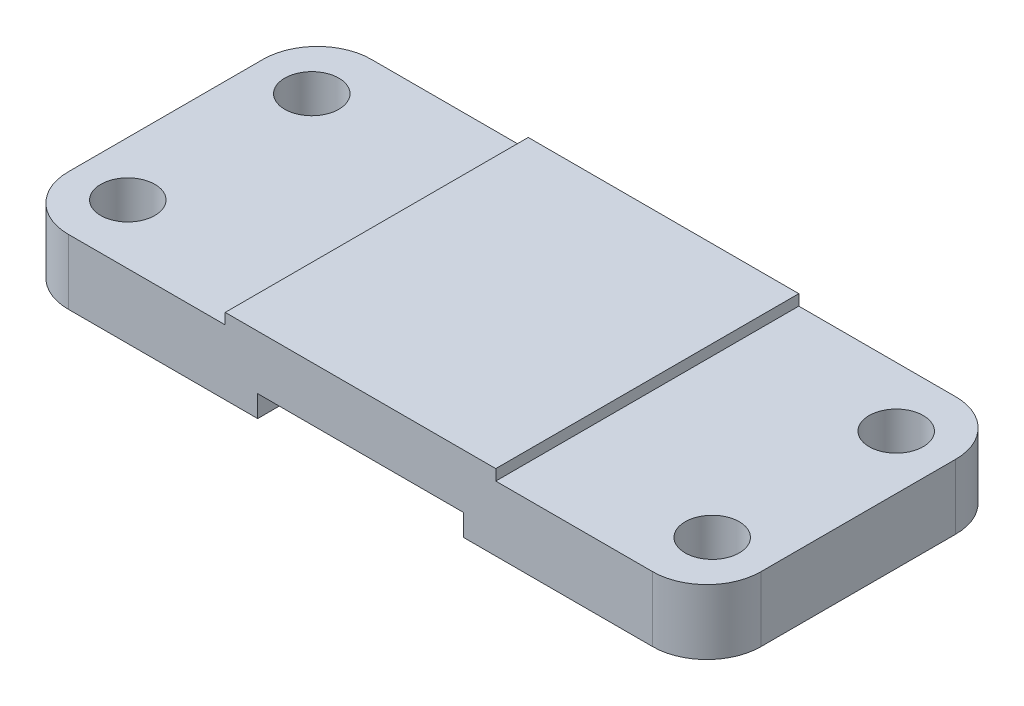
ISO-10303-21;
HEADER;
FILE_DESCRIPTION(('STEP AP214'),'2;1');
FILE_NAME('part.step','',(''),(''),'','','');
FILE_SCHEMA(('AUTOMOTIVE_DESIGN { 1 0 10303 214 1 1 1 1 }'));
ENDSEC;
DATA;
#1=APPLICATION_CONTEXT('core data for automotive mechanical design processes');
#2=APPLICATION_PROTOCOL_DEFINITION('international standard','automotive_design',2000,#1);
#3=PRODUCT_CONTEXT('',#1,'mechanical');
#4=PRODUCT('Part','Part','',(#3));
#5=PRODUCT_RELATED_PRODUCT_CATEGORY('part','',(#4));
#6=PRODUCT_DEFINITION_FORMATION('','',#4);
#7=PRODUCT_DEFINITION_CONTEXT('part definition',#1,'design');
#8=PRODUCT_DEFINITION('design','',#6,#7);
#9=PRODUCT_DEFINITION_SHAPE('','',#8);
#10=(LENGTH_UNIT() NAMED_UNIT(*) SI_UNIT(.MILLI.,.METRE.));
#11=(NAMED_UNIT(*) PLANE_ANGLE_UNIT() SI_UNIT($,.RADIAN.));
#12=(NAMED_UNIT(*) SI_UNIT($,.STERADIAN.) SOLID_ANGLE_UNIT());
#13=UNCERTAINTY_MEASURE_WITH_UNIT(LENGTH_MEASURE(1.E-05),#10,'distance_accuracy_value','');
#14=(GEOMETRIC_REPRESENTATION_CONTEXT(3) GLOBAL_UNCERTAINTY_ASSIGNED_CONTEXT((#13)) GLOBAL_UNIT_ASSIGNED_CONTEXT((#10,
#11,#12)) REPRESENTATION_CONTEXT('',''));
#15=CARTESIAN_POINT('',(0.,0.,0.));
#16=DIRECTION('',(0.,0.,1.));
#17=DIRECTION('',(1.,0.,0.));
#18=AXIS2_PLACEMENT_3D('',#15,#16,#17);
#19=CARTESIAN_POINT('',(-116.438372488934,24.2916666666667,56.));
#20=DIRECTION('',(1.,0.,0.));
#21=DIRECTION('',(0.,0.,-1.));
#22=AXIS2_PLACEMENT_3D('',#19,#20,#21);
#23=PLANE('',#22);
#24=DIRECTION('',(0.,0.,-1.));
#25=VECTOR('',#24,1.);
#26=CARTESIAN_POINT('',(-116.438372488934,24.2916666666667,56.));
#27=LINE('',#26,#25);
#28=CARTESIAN_POINT('',(-116.438372488934,24.2916666666667,46.));
#29=VERTEX_POINT('',#28);
#30=CARTESIAN_POINT('',(-116.438372488934,24.2916666666667,10.));
#31=VERTEX_POINT('',#30);
#32=EDGE_CURVE('E216',#29,#31,#27,.T.);
#33=ORIENTED_EDGE('',*,*,#32,.T.);
#34=DIRECTION('',(0.,-1.,0.));
#35=VECTOR('',#34,1.);
#36=CARTESIAN_POINT('',(-116.438372488934,24.2916666666667,10.));
#37=LINE('',#36,#35);
#38=CARTESIAN_POINT('',(-116.438372488934,12.2916666666667,10.));
#39=VERTEX_POINT('',#38);
#40=EDGE_CURVE('E318',#31,#39,#37,.T.);
#41=ORIENTED_EDGE('',*,*,#40,.T.);
#42=DIRECTION('',(0.,0.,-1.));
#43=VECTOR('',#42,1.);
#44=CARTESIAN_POINT('',(-116.438372488934,12.2916666666667,56.));
#45=LINE('',#44,#43);
#46=CARTESIAN_POINT('',(-116.438372488934,12.2916666666667,46.));
#47=VERTEX_POINT('',#46);
#48=EDGE_CURVE('E182',#47,#39,#45,.T.);
#49=ORIENTED_EDGE('',*,*,#48,.F.);
#50=DIRECTION('',(0.,-1.,0.));
#51=VECTOR('',#50,1.);
#52=CARTESIAN_POINT('',(-116.438372488934,24.2916666666667,46.));
#53=LINE('',#52,#51);
#54=EDGE_CURVE('E66',#47,#29,#53,.F.);
#55=ORIENTED_EDGE('',*,*,#54,.T.);
#56=EDGE_LOOP('',(#33,#41,#49,#55));
#57=FACE_BOUND('',#56,.T.);
#58=ADVANCED_FACE('F45',(#57),#23,.F.);
#59=CARTESIAN_POINT('',(-116.438372488934,12.2916666666667,56.));
#60=DIRECTION('',(0.,1.,0.));
#61=DIRECTION('',(0.,0.,1.));
#62=AXIS2_PLACEMENT_3D('',#59,#60,#61);
#63=PLANE('',#62);
#64=CARTESIAN_POINT('',(-106.438372488934,12.2916666666666,45.));
#65=DIRECTION('',(0.,1.,0.));
#66=DIRECTION('',(-1.,0.,0.));
#67=AXIS2_PLACEMENT_3D('',#64,#65,#66);
#68=CIRCLE('',#67,5.00000000000001);
#69=CARTESIAN_POINT('',(-111.438372488934,12.2916666666666,45.));
#70=VERTEX_POINT('',#69);
#71=EDGE_CURVE('E555',#70,#70,#68,.T.);
#72=ORIENTED_EDGE('',*,*,#71,.T.);
#73=EDGE_LOOP('',(#72));
#74=FACE_BOUND('',#73,.T.);
#75=CARTESIAN_POINT('',(-106.438372488934,12.2916666666666,11.));
#76=DIRECTION('',(0.,1.,0.));
#77=DIRECTION('',(-1.,0.,0.));
#78=AXIS2_PLACEMENT_3D('',#75,#76,#77);
#79=CIRCLE('',#78,5.);
#80=CARTESIAN_POINT('',(-111.438372488934,12.2916666666666,11.));
#81=VERTEX_POINT('',#80);
#82=EDGE_CURVE('E220',#81,#81,#79,.T.);
#83=ORIENTED_EDGE('',*,*,#82,.T.);
#84=EDGE_LOOP('',(#83));
#85=FACE_BOUND('',#84,.T.);
#86=ORIENTED_EDGE('',*,*,#48,.T.);
#87=CARTESIAN_POINT('',(-106.438372488934,12.2916666666667,10.));
#88=DIRECTION('',(0.,1.,0.));
#89=DIRECTION('',(0.,0.,1.));
#90=AXIS2_PLACEMENT_3D('',#87,#88,#89);
#91=CIRCLE('',#90,10.);
#92=CARTESIAN_POINT('',(-106.438372488934,12.2916666666667,0.));
#93=VERTEX_POINT('',#92);
#94=EDGE_CURVE('E325',#39,#93,#91,.F.);
#95=ORIENTED_EDGE('',*,*,#94,.T.);
#96=DIRECTION('',(1.,0.,0.));
#97=VECTOR('',#96,1.);
#98=CARTESIAN_POINT('',(-116.438372488934,12.2916666666667,0.));
#99=LINE('',#98,#97);
#100=CARTESIAN_POINT('',(-71.4383724889343,12.2916666666667,0.));
#101=VERTEX_POINT('',#100);
#102=EDGE_CURVE('E178',#93,#101,#99,.T.);
#103=ORIENTED_EDGE('',*,*,#102,.T.);
#104=DIRECTION('',(0.,0.,-1.));
#105=VECTOR('',#104,1.);
#106=CARTESIAN_POINT('',(-71.4383724889343,12.2916666666667,56.));
#107=LINE('',#106,#105);
#108=CARTESIAN_POINT('',(-71.4383724889343,12.2916666666667,56.));
#109=VERTEX_POINT('',#108);
#110=EDGE_CURVE('E174',#109,#101,#107,.T.);
#111=ORIENTED_EDGE('',*,*,#110,.F.);
#112=DIRECTION('',(1.,0.,0.));
#113=VECTOR('',#112,1.);
#114=CARTESIAN_POINT('',(-116.438372488934,12.2916666666667,56.));
#115=LINE('',#114,#113);
#116=CARTESIAN_POINT('',(-106.438372488934,12.2916666666667,56.));
#117=VERTEX_POINT('',#116);
#118=EDGE_CURVE('E159',#117,#109,#115,.T.);
#119=ORIENTED_EDGE('',*,*,#118,.F.);
#120=CARTESIAN_POINT('',(-106.438372488934,12.2916666666667,46.));
#121=DIRECTION('',(0.,1.,0.));
#122=DIRECTION('',(0.,0.,1.));
#123=AXIS2_PLACEMENT_3D('',#120,#121,#122);
#124=CIRCLE('',#123,10.);
#125=EDGE_CURVE('E322',#117,#47,#124,.F.);
#126=ORIENTED_EDGE('',*,*,#125,.T.);
#127=EDGE_LOOP('',(#86,#95,#103,#111,#119,#126));
#128=FACE_BOUND('',#127,.T.);
#129=ADVANCED_FACE('F176',(#74,#85,#128),#63,.F.);
#130=CARTESIAN_POINT('',(-71.4383724889343,12.2916666666667,56.));
#131=DIRECTION('',(-1.,0.,0.));
#132=DIRECTION('',(0.,0.,1.));
#133=AXIS2_PLACEMENT_3D('',#130,#131,#132);
#134=PLANE('',#133);
#135=DIRECTION('',(0.,1.,0.));
#136=VECTOR('',#135,1.);
#137=CARTESIAN_POINT('',(-71.4383724889343,12.2916666666667,0.));
#138=LINE('',#137,#136);
#139=CARTESIAN_POINT('',(-71.4383724889343,16.2916666666667,0.));
#140=VERTEX_POINT('',#139);
#141=EDGE_CURVE('E219',#101,#140,#138,.T.);
#142=ORIENTED_EDGE('',*,*,#141,.T.);
#143=DIRECTION('',(0.,0.,-1.));
#144=VECTOR('',#143,1.);
#145=CARTESIAN_POINT('',(-71.4383724889343,16.2916666666667,56.));
#146=LINE('',#145,#144);
#147=CARTESIAN_POINT('',(-71.4383724889343,16.2916666666667,56.));
#148=VERTEX_POINT('',#147);
#149=EDGE_CURVE('E183',#148,#140,#146,.T.);
#150=ORIENTED_EDGE('',*,*,#149,.F.);
#151=DIRECTION('',(0.,1.,0.));
#152=VECTOR('',#151,1.);
#153=CARTESIAN_POINT('',(-71.4383724889343,12.2916666666667,56.));
#154=LINE('',#153,#152);
#155=EDGE_CURVE('E164',#109,#148,#154,.T.);
#156=ORIENTED_EDGE('',*,*,#155,.F.);
#157=ORIENTED_EDGE('',*,*,#110,.T.);
#158=EDGE_LOOP('',(#142,#150,#156,#157));
#159=FACE_BOUND('',#158,.T.);
#160=ADVANCED_FACE('F185',(#159),#134,.F.);
#161=CARTESIAN_POINT('',(-71.4383724889343,16.2916666666667,56.));
#162=DIRECTION('',(0.,1.,0.));
#163=DIRECTION('',(0.,0.,1.));
#164=AXIS2_PLACEMENT_3D('',#161,#162,#163);
#165=PLANE('',#164);
#166=DIRECTION('',(1.,0.,0.));
#167=VECTOR('',#166,1.);
#168=CARTESIAN_POINT('',(-71.4383724889343,16.2916666666667,0.));
#169=LINE('',#168,#167);
#170=CARTESIAN_POINT('',(-33.4383724889343,16.2916666666667,0.));
#171=VERTEX_POINT('',#170);
#172=EDGE_CURVE('E223',#140,#171,#169,.T.);
#173=ORIENTED_EDGE('',*,*,#172,.T.);
#174=DIRECTION('',(0.,0.,-1.));
#175=VECTOR('',#174,1.);
#176=CARTESIAN_POINT('',(-33.4383724889343,16.2916666666667,56.));
#177=LINE('',#176,#175);
#178=CARTESIAN_POINT('',(-33.4383724889343,16.2916666666667,56.));
#179=VERTEX_POINT('',#178);
#180=EDGE_CURVE('E277',#179,#171,#177,.T.);
#181=ORIENTED_EDGE('',*,*,#180,.F.);
#182=DIRECTION('',(1.,0.,0.));
#183=VECTOR('',#182,1.);
#184=CARTESIAN_POINT('',(-71.4383724889343,16.2916666666667,56.));
#185=LINE('',#184,#183);
#186=EDGE_CURVE('E189',#148,#179,#185,.T.);
#187=ORIENTED_EDGE('',*,*,#186,.F.);
#188=ORIENTED_EDGE('',*,*,#149,.T.);
#189=EDGE_LOOP('',(#173,#181,#187,#188));
#190=FACE_BOUND('',#189,.T.);
#191=ADVANCED_FACE('F345',(#190),#165,.F.);
#192=CARTESIAN_POINT('',(-33.4383724889343,12.2916666666667,56.));
#193=DIRECTION('',(1.,0.,0.));
#194=DIRECTION('',(0.,0.,-1.));
#195=AXIS2_PLACEMENT_3D('',#192,#193,#194);
#196=PLANE('',#195);
#197=DIRECTION('',(0.,-1.,0.));
#198=VECTOR('',#197,1.);
#199=CARTESIAN_POINT('',(-33.4383724889343,12.2916666666667,0.));
#200=LINE('',#199,#198);
#201=CARTESIAN_POINT('',(-33.4383724889343,12.2916666666667,0.));
#202=VERTEX_POINT('',#201);
#203=EDGE_CURVE('E226',#171,#202,#200,.T.);
#204=ORIENTED_EDGE('',*,*,#203,.T.);
#205=DIRECTION('',(0.,0.,-1.));
#206=VECTOR('',#205,1.);
#207=CARTESIAN_POINT('',(-33.4383724889343,12.2916666666667,56.));
#208=LINE('',#207,#206);
#209=CARTESIAN_POINT('',(-33.4383724889343,12.2916666666667,56.));
#210=VERTEX_POINT('',#209);
#211=EDGE_CURVE('E273',#210,#202,#208,.T.);
#212=ORIENTED_EDGE('',*,*,#211,.F.);
#213=DIRECTION('',(0.,-1.,0.));
#214=VECTOR('',#213,1.);
#215=CARTESIAN_POINT('',(-33.4383724889343,12.2916666666667,56.));
#216=LINE('',#215,#214);
#217=EDGE_CURVE('E192',#179,#210,#216,.T.);
#218=ORIENTED_EDGE('',*,*,#217,.F.);
#219=ORIENTED_EDGE('',*,*,#180,.T.);
#220=EDGE_LOOP('',(#204,#212,#218,#219));
#221=FACE_BOUND('',#220,.T.);
#222=ADVANCED_FACE('F352',(#221),#196,.F.);
#223=CARTESIAN_POINT('',(-33.4383724889343,12.2916666666667,56.));
#224=DIRECTION('',(0.,1.,0.));
#225=DIRECTION('',(0.,0.,1.));
#226=AXIS2_PLACEMENT_3D('',#223,#224,#225);
#227=PLANE('',#226);
#228=CARTESIAN_POINT('',(1.56162751106571,12.2916666666667,11.));
#229=DIRECTION('',(0.,1.,0.));
#230=DIRECTION('',(-1.,0.,0.));
#231=AXIS2_PLACEMENT_3D('',#228,#229,#230);
#232=CIRCLE('',#231,5.);
#233=CARTESIAN_POINT('',(-3.4383724889343,12.2916666666667,11.));
#234=VERTEX_POINT('',#233);
#235=EDGE_CURVE('E531',#234,#234,#232,.T.);
#236=ORIENTED_EDGE('',*,*,#235,.T.);
#237=EDGE_LOOP('',(#236));
#238=FACE_BOUND('',#237,.T.);
#239=CARTESIAN_POINT('',(1.56162751106571,12.2916666666667,45.));
#240=DIRECTION('',(0.,1.,0.));
#241=DIRECTION('',(-1.,0.,0.));
#242=AXIS2_PLACEMENT_3D('',#239,#240,#241);
#243=CIRCLE('',#242,5.00000000000001);
#244=CARTESIAN_POINT('',(-3.4383724889343,12.2916666666667,45.));
#245=VERTEX_POINT('',#244);
#246=EDGE_CURVE('E536',#245,#245,#243,.T.);
#247=ORIENTED_EDGE('',*,*,#246,.T.);
#248=EDGE_LOOP('',(#247));
#249=FACE_BOUND('',#248,.T.);
#250=DIRECTION('',(0.,0.,-1.));
#251=VECTOR('',#250,1.);
#252=CARTESIAN_POINT('',(11.5616275110657,12.2916666666667,56.));
#253=LINE('',#252,#251);
#254=CARTESIAN_POINT('',(11.5616275110657,12.2916666666667,46.));
#255=VERTEX_POINT('',#254);
#256=CARTESIAN_POINT('',(11.5616275110657,12.2916666666667,10.));
#257=VERTEX_POINT('',#256);
#258=EDGE_CURVE('E269',#255,#257,#253,.T.);
#259=ORIENTED_EDGE('',*,*,#258,.F.);
#260=CARTESIAN_POINT('',(1.56162751106571,12.2916666666667,46.));
#261=DIRECTION('',(0.,1.,0.));
#262=DIRECTION('',(0.,0.,1.));
#263=AXIS2_PLACEMENT_3D('',#260,#261,#262);
#264=CIRCLE('',#263,10.);
#265=CARTESIAN_POINT('',(1.56162751106569,12.2916666666667,56.));
#266=VERTEX_POINT('',#265);
#267=EDGE_CURVE('E307',#255,#266,#264,.F.);
#268=ORIENTED_EDGE('',*,*,#267,.T.);
#269=DIRECTION('',(1.,0.,0.));
#270=VECTOR('',#269,1.);
#271=CARTESIAN_POINT('',(-33.4383724889343,12.2916666666667,56.));
#272=LINE('',#271,#270);
#273=EDGE_CURVE('E198',#210,#266,#272,.T.);
#274=ORIENTED_EDGE('',*,*,#273,.F.);
#275=ORIENTED_EDGE('',*,*,#211,.T.);
#276=DIRECTION('',(1.,0.,0.));
#277=VECTOR('',#276,1.);
#278=CARTESIAN_POINT('',(-33.4383724889343,12.2916666666667,0.));
#279=LINE('',#278,#277);
#280=CARTESIAN_POINT('',(1.56162751106569,12.2916666666667,0.));
#281=VERTEX_POINT('',#280);
#282=EDGE_CURVE('E229',#202,#281,#279,.T.);
#283=ORIENTED_EDGE('',*,*,#282,.T.);
#284=CARTESIAN_POINT('',(1.56162751106571,12.2916666666667,10.));
#285=DIRECTION('',(0.,1.,0.));
#286=DIRECTION('',(0.,0.,1.));
#287=AXIS2_PLACEMENT_3D('',#284,#285,#286);
#288=CIRCLE('',#287,10.);
#289=EDGE_CURVE('E304',#281,#257,#288,.F.);
#290=ORIENTED_EDGE('',*,*,#289,.T.);
#291=EDGE_LOOP('',(#259,#268,#274,#275,#283,#290));
#292=FACE_BOUND('',#291,.T.);
#293=ADVANCED_FACE('F356',(#238,#249,#292),#227,.F.);
#294=CARTESIAN_POINT('',(11.5616275110657,24.2916666666667,56.));
#295=DIRECTION('',(-1.,0.,0.));
#296=DIRECTION('',(0.,-1.,0.));
#297=AXIS2_PLACEMENT_3D('',#294,#295,#296);
#298=PLANE('',#297);
#299=DIRECTION('',(0.,0.,-1.));
#300=VECTOR('',#299,1.);
#301=CARTESIAN_POINT('',(11.5616275110657,24.2916666666667,56.));
#302=LINE('',#301,#300);
#303=CARTESIAN_POINT('',(11.5616275110657,24.2916666666667,46.));
#304=VERTEX_POINT('',#303);
#305=CARTESIAN_POINT('',(11.5616275110657,24.2916666666667,10.));
#306=VERTEX_POINT('',#305);
#307=EDGE_CURVE('E265',#304,#306,#302,.T.);
#308=ORIENTED_EDGE('',*,*,#307,.F.);
#309=DIRECTION('',(0.,1.,0.));
#310=VECTOR('',#309,1.);
#311=CARTESIAN_POINT('',(11.5616275110657,12.2916666666667,46.));
#312=LINE('',#311,#310);
#313=EDGE_CURVE('E301',#304,#255,#312,.F.);
#314=ORIENTED_EDGE('',*,*,#313,.T.);
#315=ORIENTED_EDGE('',*,*,#258,.T.);
#316=DIRECTION('',(0.,1.,0.));
#317=VECTOR('',#316,1.);
#318=CARTESIAN_POINT('',(11.5616275110657,24.2916666666667,10.));
#319=LINE('',#318,#317);
#320=EDGE_CURVE('E297',#257,#306,#319,.T.);
#321=ORIENTED_EDGE('',*,*,#320,.T.);
#322=EDGE_LOOP('',(#308,#314,#315,#321));
#323=FACE_BOUND('',#322,.T.);
#324=ADVANCED_FACE('F385',(#323),#298,.F.);
#325=CARTESIAN_POINT('',(-27.4383724889343,24.2916666666667,56.));
#326=DIRECTION('',(0.,-1.,0.));
#327=DIRECTION('',(1.,0.,0.));
#328=AXIS2_PLACEMENT_3D('',#325,#326,#327);
#329=PLANE('',#328);
#330=CARTESIAN_POINT('',(1.56162751106571,24.2916666666667,11.));
#331=DIRECTION('',(0.,1.,0.));
#332=DIRECTION('',(-1.,0.,0.));
#333=AXIS2_PLACEMENT_3D('',#330,#331,#332);
#334=CIRCLE('',#333,5.);
#335=CARTESIAN_POINT('',(-3.4383724889343,24.2916666666667,11.));
#336=VERTEX_POINT('',#335);
#337=EDGE_CURVE('E534',#336,#336,#334,.T.);
#338=ORIENTED_EDGE('',*,*,#337,.F.);
#339=EDGE_LOOP('',(#338));
#340=FACE_BOUND('',#339,.T.);
#341=CARTESIAN_POINT('',(1.56162751106571,24.2916666666667,45.));
#342=DIRECTION('',(0.,1.,0.));
#343=DIRECTION('',(-1.,0.,0.));
#344=AXIS2_PLACEMENT_3D('',#341,#342,#343);
#345=CIRCLE('',#344,5.00000000000001);
#346=CARTESIAN_POINT('',(-3.4383724889343,24.2916666666667,45.));
#347=VERTEX_POINT('',#346);
#348=EDGE_CURVE('E541',#347,#347,#345,.T.);
#349=ORIENTED_EDGE('',*,*,#348,.F.);
#350=EDGE_LOOP('',(#349));
#351=FACE_BOUND('',#350,.T.);
#352=DIRECTION('',(-1.,0.,0.));
#353=VECTOR('',#352,1.);
#354=CARTESIAN_POINT('',(-27.4383724889343,24.2916666666667,56.));
#355=LINE('',#354,#353);
#356=CARTESIAN_POINT('',(1.56162751106571,24.2916666666667,56.));
#357=VERTEX_POINT('',#356);
#358=CARTESIAN_POINT('',(-27.4383724889343,24.2916666666667,56.));
#359=VERTEX_POINT('',#358);
#360=EDGE_CURVE('E201',#357,#359,#355,.T.);
#361=ORIENTED_EDGE('',*,*,#360,.F.);
#362=CARTESIAN_POINT('',(1.56162751106571,24.2916666666667,46.));
#363=DIRECTION('',(0.,-1.,0.));
#364=DIRECTION('',(1.,0.,0.));
#365=AXIS2_PLACEMENT_3D('',#362,#363,#364);
#366=CIRCLE('',#365,10.);
#367=EDGE_CURVE('E294',#357,#304,#366,.F.);
#368=ORIENTED_EDGE('',*,*,#367,.T.);
#369=ORIENTED_EDGE('',*,*,#307,.T.);
#370=CARTESIAN_POINT('',(1.56162751106571,24.2916666666667,10.));
#371=DIRECTION('',(0.,-1.,0.));
#372=DIRECTION('',(1.,0.,0.));
#373=AXIS2_PLACEMENT_3D('',#370,#371,#372);
#374=CIRCLE('',#373,10.);
#375=CARTESIAN_POINT('',(1.56162751106571,24.2916666666667,0.));
#376=VERTEX_POINT('',#375);
#377=EDGE_CURVE('E291',#306,#376,#374,.F.);
#378=ORIENTED_EDGE('',*,*,#377,.T.);
#379=DIRECTION('',(-1.,0.,0.));
#380=VECTOR('',#379,1.);
#381=CARTESIAN_POINT('',(-27.4383724889343,24.2916666666667,0.));
#382=LINE('',#381,#380);
#383=CARTESIAN_POINT('',(-27.4383724889343,24.2916666666667,0.));
#384=VERTEX_POINT('',#383);
#385=EDGE_CURVE('E233',#376,#384,#382,.T.);
#386=ORIENTED_EDGE('',*,*,#385,.T.);
#387=DIRECTION('',(0.,0.,-1.));
#388=VECTOR('',#387,1.);
#389=CARTESIAN_POINT('',(-27.4383724889343,24.2916666666667,56.));
#390=LINE('',#389,#388);
#391=EDGE_CURVE('E261',#359,#384,#390,.T.);
#392=ORIENTED_EDGE('',*,*,#391,.F.);
#393=EDGE_LOOP('',(#361,#368,#369,#378,#386,#392));
#394=FACE_BOUND('',#393,.T.);
#395=ADVANCED_FACE('F364',(#340,#351,#394),#329,.F.);
#396=CARTESIAN_POINT('',(-27.4383724889343,24.2916666666667,56.));
#397=DIRECTION('',(-1.,0.,0.));
#398=DIRECTION('',(0.,0.,1.));
#399=AXIS2_PLACEMENT_3D('',#396,#397,#398);
#400=PLANE('',#399);
#401=DIRECTION('',(0.,1.,0.));
#402=VECTOR('',#401,1.);
#403=CARTESIAN_POINT('',(-27.4383724889343,24.2916666666667,0.));
#404=LINE('',#403,#402);
#405=CARTESIAN_POINT('',(-27.4383724889343,26.2916666666667,0.));
#406=VERTEX_POINT('',#405);
#407=EDGE_CURVE('E236',#384,#406,#404,.T.);
#408=ORIENTED_EDGE('',*,*,#407,.T.);
#409=DIRECTION('',(0.,0.,-1.));
#410=VECTOR('',#409,1.);
#411=CARTESIAN_POINT('',(-27.4383724889343,26.2916666666667,56.));
#412=LINE('',#411,#410);
#413=CARTESIAN_POINT('',(-27.4383724889343,26.2916666666667,56.));
#414=VERTEX_POINT('',#413);
#415=EDGE_CURVE('E257',#414,#406,#412,.T.);
#416=ORIENTED_EDGE('',*,*,#415,.F.);
#417=DIRECTION('',(0.,1.,0.));
#418=VECTOR('',#417,1.);
#419=CARTESIAN_POINT('',(-27.4383724889343,24.2916666666667,56.));
#420=LINE('',#419,#418);
#421=EDGE_CURVE('E204',#359,#414,#420,.T.);
#422=ORIENTED_EDGE('',*,*,#421,.F.);
#423=ORIENTED_EDGE('',*,*,#391,.T.);
#424=EDGE_LOOP('',(#408,#416,#422,#423));
#425=FACE_BOUND('',#424,.T.);
#426=ADVANCED_FACE('F370',(#425),#400,.F.);
#427=CARTESIAN_POINT('',(-77.4383724889343,26.2916666666667,56.));
#428=DIRECTION('',(0.,-1.,0.));
#429=DIRECTION('',(0.,0.,-1.));
#430=AXIS2_PLACEMENT_3D('',#427,#428,#429);
#431=PLANE('',#430);
#432=DIRECTION('',(-1.,0.,0.));
#433=VECTOR('',#432,1.);
#434=CARTESIAN_POINT('',(-77.4383724889343,26.2916666666667,0.));
#435=LINE('',#434,#433);
#436=CARTESIAN_POINT('',(-77.4383724889343,26.2916666666667,0.));
#437=VERTEX_POINT('',#436);
#438=EDGE_CURVE('E239',#406,#437,#435,.T.);
#439=ORIENTED_EDGE('',*,*,#438,.T.);
#440=DIRECTION('',(0.,0.,-1.));
#441=VECTOR('',#440,1.);
#442=CARTESIAN_POINT('',(-77.4383724889343,26.2916666666667,56.));
#443=LINE('',#442,#441);
#444=CARTESIAN_POINT('',(-77.4383724889343,26.2916666666667,56.));
#445=VERTEX_POINT('',#444);
#446=EDGE_CURVE('E253',#445,#437,#443,.T.);
#447=ORIENTED_EDGE('',*,*,#446,.F.);
#448=DIRECTION('',(-1.,0.,0.));
#449=VECTOR('',#448,1.);
#450=CARTESIAN_POINT('',(-77.4383724889343,26.2916666666667,56.));
#451=LINE('',#450,#449);
#452=EDGE_CURVE('E207',#414,#445,#451,.T.);
#453=ORIENTED_EDGE('',*,*,#452,.F.);
#454=ORIENTED_EDGE('',*,*,#415,.T.);
#455=EDGE_LOOP('',(#439,#447,#453,#454));
#456=FACE_BOUND('',#455,.T.);
#457=ADVANCED_FACE('F374',(#456),#431,.F.);
#458=CARTESIAN_POINT('',(-77.4383724889343,24.2916666666667,56.));
#459=DIRECTION('',(1.,0.,0.));
#460=DIRECTION('',(0.,0.,-1.));
#461=AXIS2_PLACEMENT_3D('',#458,#459,#460);
#462=PLANE('',#461);
#463=DIRECTION('',(0.,-1.,0.));
#464=VECTOR('',#463,1.);
#465=CARTESIAN_POINT('',(-77.4383724889343,24.2916666666667,0.));
#466=LINE('',#465,#464);
#467=CARTESIAN_POINT('',(-77.4383724889343,24.2916666666667,0.));
#468=VERTEX_POINT('',#467);
#469=EDGE_CURVE('E242',#437,#468,#466,.T.);
#470=ORIENTED_EDGE('',*,*,#469,.T.);
#471=DIRECTION('',(0.,0.,-1.));
#472=VECTOR('',#471,1.);
#473=CARTESIAN_POINT('',(-77.4383724889343,24.2916666666667,56.));
#474=LINE('',#473,#472);
#475=CARTESIAN_POINT('',(-77.4383724889343,24.2916666666667,56.));
#476=VERTEX_POINT('',#475);
#477=EDGE_CURVE('E249',#476,#468,#474,.T.);
#478=ORIENTED_EDGE('',*,*,#477,.F.);
#479=DIRECTION('',(0.,-1.,0.));
#480=VECTOR('',#479,1.);
#481=CARTESIAN_POINT('',(-77.4383724889343,24.2916666666667,56.));
#482=LINE('',#481,#480);
#483=EDGE_CURVE('E210',#445,#476,#482,.T.);
#484=ORIENTED_EDGE('',*,*,#483,.F.);
#485=ORIENTED_EDGE('',*,*,#446,.T.);
#486=EDGE_LOOP('',(#470,#478,#484,#485));
#487=FACE_BOUND('',#486,.T.);
#488=ADVANCED_FACE('F378',(#487),#462,.F.);
#489=CARTESIAN_POINT('',(-116.438372488934,24.2916666666667,56.));
#490=DIRECTION('',(0.,-1.,0.));
#491=DIRECTION('',(1.,0.,0.));
#492=AXIS2_PLACEMENT_3D('',#489,#490,#491);
#493=PLANE('',#492);
#494=CARTESIAN_POINT('',(-106.438372488934,24.2916666666667,45.));
#495=DIRECTION('',(0.,1.,0.));
#496=DIRECTION('',(-1.,0.,0.));
#497=AXIS2_PLACEMENT_3D('',#494,#495,#496);
#498=CIRCLE('',#497,5.00000000000001);
#499=CARTESIAN_POINT('',(-111.438372488934,24.2916666666667,45.));
#500=VERTEX_POINT('',#499);
#501=EDGE_CURVE('E551',#500,#500,#498,.T.);
#502=ORIENTED_EDGE('',*,*,#501,.F.);
#503=EDGE_LOOP('',(#502));
#504=FACE_BOUND('',#503,.T.);
#505=CARTESIAN_POINT('',(-106.438372488934,24.2916666666667,11.));
#506=DIRECTION('',(0.,1.,0.));
#507=DIRECTION('',(-1.,0.,0.));
#508=AXIS2_PLACEMENT_3D('',#505,#506,#507);
#509=CIRCLE('',#508,5.);
#510=CARTESIAN_POINT('',(-111.438372488934,24.2916666666667,11.));
#511=VERTEX_POINT('',#510);
#512=EDGE_CURVE('E548',#511,#511,#509,.T.);
#513=ORIENTED_EDGE('',*,*,#512,.F.);
#514=EDGE_LOOP('',(#513));
#515=FACE_BOUND('',#514,.T.);
#516=DIRECTION('',(-1.,0.,0.));
#517=VECTOR('',#516,1.);
#518=CARTESIAN_POINT('',(-116.438372488934,24.2916666666667,0.));
#519=LINE('',#518,#517);
#520=CARTESIAN_POINT('',(-106.438372488934,24.2916666666667,0.));
#521=VERTEX_POINT('',#520);
#522=EDGE_CURVE('E171',#468,#521,#519,.T.);
#523=ORIENTED_EDGE('',*,*,#522,.T.);
#524=CARTESIAN_POINT('',(-106.438372488934,24.2916666666667,10.));
#525=DIRECTION('',(0.,-1.,0.));
#526=DIRECTION('',(1.,0.,0.));
#527=AXIS2_PLACEMENT_3D('',#524,#525,#526);
#528=CIRCLE('',#527,10.);
#529=EDGE_CURVE('E11',#521,#31,#528,.F.);
#530=ORIENTED_EDGE('',*,*,#529,.T.);
#531=ORIENTED_EDGE('',*,*,#32,.F.);
#532=CARTESIAN_POINT('',(-106.438372488934,24.2916666666667,46.));
#533=DIRECTION('',(0.,-1.,0.));
#534=DIRECTION('',(1.,0.,0.));
#535=AXIS2_PLACEMENT_3D('',#532,#533,#534);
#536=CIRCLE('',#535,10.);
#537=CARTESIAN_POINT('',(-106.438372488934,24.2916666666667,56.));
#538=VERTEX_POINT('',#537);
#539=EDGE_CURVE('E54',#29,#538,#536,.F.);
#540=ORIENTED_EDGE('',*,*,#539,.T.);
#541=DIRECTION('',(-1.,0.,0.));
#542=VECTOR('',#541,1.);
#543=CARTESIAN_POINT('',(-116.438372488934,24.2916666666667,56.));
#544=LINE('',#543,#542);
#545=EDGE_CURVE('E213',#476,#538,#544,.T.);
#546=ORIENTED_EDGE('',*,*,#545,.F.);
#547=ORIENTED_EDGE('',*,*,#477,.T.);
#548=EDGE_LOOP('',(#523,#530,#531,#540,#546,#547));
#549=FACE_BOUND('',#548,.T.);
#550=ADVANCED_FACE('F330',(#504,#515,#549),#493,.F.);
#551=CARTESIAN_POINT('',(0.,0.,56.));
#552=DIRECTION('',(0.,0.,1.));
#553=DIRECTION('',(1.,0.,0.));
#554=AXIS2_PLACEMENT_3D('',#551,#552,#553);
#555=PLANE('',#554);
#556=ORIENTED_EDGE('',*,*,#273,.T.);
#557=DIRECTION('',(0.,1.,0.));
#558=VECTOR('',#557,1.);
#559=CARTESIAN_POINT('',(1.56162751106571,24.2916666666667,56.));
#560=LINE('',#559,#558);
#561=EDGE_CURVE('E287',#266,#357,#560,.T.);
#562=ORIENTED_EDGE('',*,*,#561,.T.);
#563=ORIENTED_EDGE('',*,*,#360,.T.);
#564=ORIENTED_EDGE('',*,*,#421,.T.);
#565=ORIENTED_EDGE('',*,*,#452,.T.);
#566=ORIENTED_EDGE('',*,*,#483,.T.);
#567=ORIENTED_EDGE('',*,*,#545,.T.);
#568=DIRECTION('',(0.,-1.,0.));
#569=VECTOR('',#568,1.);
#570=CARTESIAN_POINT('',(-106.438372488934,12.2916666666667,56.));
#571=LINE('',#570,#569);
#572=EDGE_CURVE('E168',#538,#117,#571,.T.);
#573=ORIENTED_EDGE('',*,*,#572,.T.);
#574=ORIENTED_EDGE('',*,*,#118,.T.);
#575=ORIENTED_EDGE('',*,*,#155,.T.);
#576=ORIENTED_EDGE('',*,*,#186,.T.);
#577=ORIENTED_EDGE('',*,*,#217,.T.);
#578=EDGE_LOOP('',(#556,#562,#563,#564,#565,#566,#567,#573,#574,#575,#576,#577));
#579=FACE_BOUND('',#578,.T.);
#580=ADVANCED_FACE('F162',(#579),#555,.T.);
#581=CARTESIAN_POINT('',(0.,0.,0.));
#582=DIRECTION('',(0.,0.,1.));
#583=DIRECTION('',(1.,0.,0.));
#584=AXIS2_PLACEMENT_3D('',#581,#582,#583);
#585=PLANE('',#584);
#586=ORIENTED_EDGE('',*,*,#385,.F.);
#587=DIRECTION('',(0.,1.,0.));
#588=VECTOR('',#587,1.);
#589=CARTESIAN_POINT('',(1.56162751106571,0.,0.));
#590=LINE('',#589,#588);
#591=EDGE_CURVE('E313',#376,#281,#590,.F.);
#592=ORIENTED_EDGE('',*,*,#591,.T.);
#593=ORIENTED_EDGE('',*,*,#282,.F.);
#594=ORIENTED_EDGE('',*,*,#203,.F.);
#595=ORIENTED_EDGE('',*,*,#172,.F.);
#596=ORIENTED_EDGE('',*,*,#141,.F.);
#597=ORIENTED_EDGE('',*,*,#102,.F.);
#598=DIRECTION('',(0.,-1.,0.));
#599=VECTOR('',#598,1.);
#600=CARTESIAN_POINT('',(-106.438372488934,0.,0.));
#601=LINE('',#600,#599);
#602=EDGE_CURVE('E310',#93,#521,#601,.F.);
#603=ORIENTED_EDGE('',*,*,#602,.T.);
#604=ORIENTED_EDGE('',*,*,#522,.F.);
#605=ORIENTED_EDGE('',*,*,#469,.F.);
#606=ORIENTED_EDGE('',*,*,#438,.F.);
#607=ORIENTED_EDGE('',*,*,#407,.F.);
#608=EDGE_LOOP('',(#586,#592,#593,#594,#595,#596,#597,#603,#604,#605,#606,#607));
#609=FACE_BOUND('',#608,.T.);
#610=ADVANCED_FACE('F340',(#609),#585,.F.);
#611=CARTESIAN_POINT('',(1.56162751106571,0.,46.));
#612=DIRECTION('',(0.,-1.,0.));
#613=DIRECTION('',(1.,0.,0.));
#614=AXIS2_PLACEMENT_3D('',#611,#612,#613);
#615=CYLINDRICAL_SURFACE('',#614,10.);
#616=ORIENTED_EDGE('',*,*,#267,.F.);
#617=ORIENTED_EDGE('',*,*,#313,.F.);
#618=ORIENTED_EDGE('',*,*,#367,.F.);
#619=ORIENTED_EDGE('',*,*,#561,.F.);
#620=EDGE_LOOP('',(#616,#617,#618,#619));
#621=FACE_BOUND('',#620,.T.);
#622=ADVANCED_FACE('F360',(#621),#615,.T.);
#623=CARTESIAN_POINT('',(1.56162751106571,24.2916666666667,10.));
#624=DIRECTION('',(0.,1.,0.));
#625=DIRECTION('',(-1.,0.,0.));
#626=AXIS2_PLACEMENT_3D('',#623,#624,#625);
#627=CYLINDRICAL_SURFACE('',#626,10.);
#628=ORIENTED_EDGE('',*,*,#289,.F.);
#629=ORIENTED_EDGE('',*,*,#591,.F.);
#630=ORIENTED_EDGE('',*,*,#377,.F.);
#631=ORIENTED_EDGE('',*,*,#320,.F.);
#632=EDGE_LOOP('',(#628,#629,#630,#631));
#633=FACE_BOUND('',#632,.T.);
#634=ADVANCED_FACE('F382',(#633),#627,.T.);
#635=CARTESIAN_POINT('',(-106.438372488934,24.2916666666667,10.));
#636=DIRECTION('',(0.,-1.,0.));
#637=DIRECTION('',(0.,0.,-1.));
#638=AXIS2_PLACEMENT_3D('',#635,#636,#637);
#639=CYLINDRICAL_SURFACE('',#638,10.);
#640=ORIENTED_EDGE('',*,*,#529,.F.);
#641=ORIENTED_EDGE('',*,*,#602,.F.);
#642=ORIENTED_EDGE('',*,*,#94,.F.);
#643=ORIENTED_EDGE('',*,*,#40,.F.);
#644=EDGE_LOOP('',(#640,#641,#642,#643));
#645=FACE_BOUND('',#644,.T.);
#646=ADVANCED_FACE('F336',(#645),#639,.T.);
#647=CARTESIAN_POINT('',(-106.438372488934,0.,46.));
#648=DIRECTION('',(0.,1.,0.));
#649=DIRECTION('',(0.,0.,1.));
#650=AXIS2_PLACEMENT_3D('',#647,#648,#649);
#651=CYLINDRICAL_SURFACE('',#650,10.);
#652=ORIENTED_EDGE('',*,*,#539,.F.);
#653=ORIENTED_EDGE('',*,*,#54,.F.);
#654=ORIENTED_EDGE('',*,*,#125,.F.);
#655=ORIENTED_EDGE('',*,*,#572,.F.);
#656=EDGE_LOOP('',(#652,#653,#654,#655));
#657=FACE_BOUND('',#656,.T.);
#658=ADVANCED_FACE('F47',(#657),#651,.T.);
#659=CARTESIAN_POINT('',(-106.438372488934,12.2916666666666,11.));
#660=DIRECTION('',(0.,1.,0.));
#661=DIRECTION('',(-1.,0.,0.));
#662=AXIS2_PLACEMENT_3D('',#659,#660,#661);
#663=CYLINDRICAL_SURFACE('',#662,5.);
#664=ORIENTED_EDGE('',*,*,#82,.F.);
#665=EDGE_LOOP('',(#664));
#666=FACE_BOUND('',#665,.T.);
#667=ORIENTED_EDGE('',*,*,#512,.T.);
#668=EDGE_LOOP('',(#667));
#669=FACE_BOUND('',#668,.T.);
#670=ADVANCED_FACE('F414',(#666,#669),#663,.F.);
#671=CARTESIAN_POINT('',(-106.438372488934,12.2916666666666,45.));
#672=DIRECTION('',(0.,1.,0.));
#673=DIRECTION('',(-1.,0.,0.));
#674=AXIS2_PLACEMENT_3D('',#671,#672,#673);
#675=CYLINDRICAL_SURFACE('',#674,5.00000000000001);
#676=ORIENTED_EDGE('',*,*,#71,.F.);
#677=EDGE_LOOP('',(#676));
#678=FACE_BOUND('',#677,.T.);
#679=ORIENTED_EDGE('',*,*,#501,.T.);
#680=EDGE_LOOP('',(#679));
#681=FACE_BOUND('',#680,.T.);
#682=ADVANCED_FACE('F418',(#678,#681),#675,.F.);
#683=CARTESIAN_POINT('',(1.56162751106571,12.2916666666667,45.));
#684=DIRECTION('',(0.,1.,0.));
#685=DIRECTION('',(-1.,0.,0.));
#686=AXIS2_PLACEMENT_3D('',#683,#684,#685);
#687=CYLINDRICAL_SURFACE('',#686,5.00000000000001);
#688=ORIENTED_EDGE('',*,*,#246,.F.);
#689=EDGE_LOOP('',(#688));
#690=FACE_BOUND('',#689,.T.);
#691=ORIENTED_EDGE('',*,*,#348,.T.);
#692=EDGE_LOOP('',(#691));
#693=FACE_BOUND('',#692,.T.);
#694=ADVANCED_FACE('F425',(#690,#693),#687,.F.);
#695=CARTESIAN_POINT('',(1.56162751106571,12.2916666666667,11.));
#696=DIRECTION('',(0.,1.,0.));
#697=DIRECTION('',(-1.,0.,0.));
#698=AXIS2_PLACEMENT_3D('',#695,#696,#697);
#699=CYLINDRICAL_SURFACE('',#698,5.);
#700=ORIENTED_EDGE('',*,*,#235,.F.);
#701=EDGE_LOOP('',(#700));
#702=FACE_BOUND('',#701,.T.);
#703=ORIENTED_EDGE('',*,*,#337,.T.);
#704=EDGE_LOOP('',(#703));
#705=FACE_BOUND('',#704,.T.);
#706=ADVANCED_FACE('F432',(#702,#705),#699,.F.);
#707=CLOSED_SHELL('',(#58,#129,#160,#191,#222,#293,#324,#395,#426,#457,#488,#550,#580,#610,#622,
#634,#646,#658,#670,#682,#694,#706));
#708=MANIFOLD_SOLID_BREP('B2',#707);
#709=ADVANCED_BREP_SHAPE_REPRESENTATION('',(#18,#708),#14);
#710=SHAPE_DEFINITION_REPRESENTATION(#9,#709);
ENDSEC;
END-ISO-10303-21;
